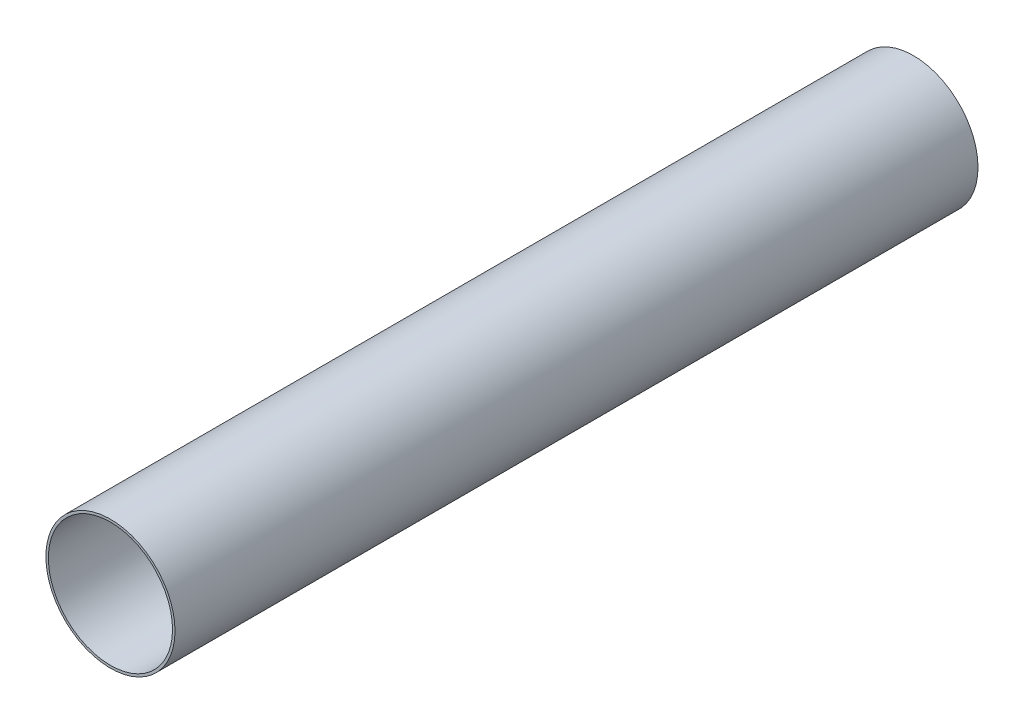
ISO-10303-21;
HEADER;
FILE_DESCRIPTION(('STEP AP214'),'2;1');
FILE_NAME('part.step','',(''),(''),'','','');
FILE_SCHEMA(('AUTOMOTIVE_DESIGN { 1 0 10303 214 1 1 1 1 }'));
ENDSEC;
DATA;
#1=APPLICATION_CONTEXT('core data for automotive mechanical design processes');
#2=APPLICATION_PROTOCOL_DEFINITION('international standard','automotive_design',2000,#1);
#3=PRODUCT_CONTEXT('',#1,'mechanical');
#4=PRODUCT('Part','Part','',(#3));
#5=PRODUCT_RELATED_PRODUCT_CATEGORY('part','',(#4));
#6=PRODUCT_DEFINITION_FORMATION('','',#4);
#7=PRODUCT_DEFINITION_CONTEXT('part definition',#1,'design');
#8=PRODUCT_DEFINITION('design','',#6,#7);
#9=PRODUCT_DEFINITION_SHAPE('','',#8);
#10=(LENGTH_UNIT() NAMED_UNIT(*) SI_UNIT(.MILLI.,.METRE.));
#11=(NAMED_UNIT(*) PLANE_ANGLE_UNIT() SI_UNIT($,.RADIAN.));
#12=(NAMED_UNIT(*) SI_UNIT($,.STERADIAN.) SOLID_ANGLE_UNIT());
#13=UNCERTAINTY_MEASURE_WITH_UNIT(LENGTH_MEASURE(1.E-05),#10,'distance_accuracy_value','');
#14=(GEOMETRIC_REPRESENTATION_CONTEXT(3) GLOBAL_UNCERTAINTY_ASSIGNED_CONTEXT((#13)) GLOBAL_UNIT_ASSIGNED_CONTEXT((#10,
#11,#12)) REPRESENTATION_CONTEXT('',''));
#15=CARTESIAN_POINT('',(0.,0.,0.));
#16=DIRECTION('',(0.,0.,1.));
#17=DIRECTION('',(1.,0.,0.));
#18=AXIS2_PLACEMENT_3D('',#15,#16,#17);
#19=CARTESIAN_POINT('',(2.71657696337968E-12,0.,-970.));
#20=DIRECTION('',(0.,0.,1.));
#21=DIRECTION('',(1.,0.,0.));
#22=AXIS2_PLACEMENT_3D('',#19,#20,#21);
#23=CYLINDRICAL_SURFACE('',#22,77.9999999999991);
#24=CARTESIAN_POINT('',(2.71657696337968E-12,0.,-970.));
#25=DIRECTION('',(0.,0.,1.));
#26=DIRECTION('',(1.,0.,0.));
#27=AXIS2_PLACEMENT_3D('',#24,#25,#26);
#28=CIRCLE('',#27,77.9999999999991);
#29=CARTESIAN_POINT('',(78.0000000000018,0.,-970.));
#30=VERTEX_POINT('',#29);
#31=EDGE_CURVE('E10',#30,#30,#28,.T.);
#32=ORIENTED_EDGE('',*,*,#31,.T.);
#33=EDGE_LOOP('',(#32));
#34=FACE_BOUND('',#33,.T.);
#35=CARTESIAN_POINT('',(2.71657696337968E-12,0.,0.));
#36=DIRECTION('',(0.,0.,1.));
#37=DIRECTION('',(1.,0.,0.));
#38=AXIS2_PLACEMENT_3D('',#35,#36,#37);
#39=CIRCLE('',#38,77.9999999999991);
#40=CARTESIAN_POINT('',(78.0000000000018,0.,0.));
#41=VERTEX_POINT('',#40);
#42=EDGE_CURVE('E34',#41,#41,#39,.T.);
#43=ORIENTED_EDGE('',*,*,#42,.F.);
#44=EDGE_LOOP('',(#43));
#45=FACE_BOUND('',#44,.T.);
#46=ADVANCED_FACE('F31',(#34,#45),#23,.T.);
#47=CARTESIAN_POINT('',(2.71657696337968E-12,0.,-970.));
#48=DIRECTION('',(0.,0.,1.));
#49=DIRECTION('',(1.,0.,0.));
#50=AXIS2_PLACEMENT_3D('',#47,#48,#49);
#51=PLANE('',#50);
#52=CARTESIAN_POINT('',(2.71657696337968E-12,0.,-970.));
#53=DIRECTION('',(0.,0.,1.));
#54=DIRECTION('',(1.,0.,0.));
#55=AXIS2_PLACEMENT_3D('',#52,#53,#54);
#56=CIRCLE('',#55,74.9999999999991);
#57=CARTESIAN_POINT('',(75.0000000000018,0.,-970.));
#58=VERTEX_POINT('',#57);
#59=EDGE_CURVE('E41',#58,#58,#56,.T.);
#60=ORIENTED_EDGE('',*,*,#59,.T.);
#61=EDGE_LOOP('',(#60));
#62=FACE_BOUND('',#61,.T.);
#63=ORIENTED_EDGE('',*,*,#31,.F.);
#64=EDGE_LOOP('',(#63));
#65=FACE_BOUND('',#64,.T.);
#66=ADVANCED_FACE('F49',(#62,#65),#51,.F.);
#67=CARTESIAN_POINT('',(2.71657696337968E-12,0.,0.));
#68=DIRECTION('',(0.,0.,1.));
#69=DIRECTION('',(1.,0.,0.));
#70=AXIS2_PLACEMENT_3D('',#67,#68,#69);
#71=PLANE('',#70);
#72=CARTESIAN_POINT('',(2.71657696337968E-12,0.,0.));
#73=DIRECTION('',(0.,0.,1.));
#74=DIRECTION('',(1.,0.,0.));
#75=AXIS2_PLACEMENT_3D('',#72,#73,#74);
#76=CIRCLE('',#75,74.9999999999991);
#77=CARTESIAN_POINT('',(75.0000000000018,0.,0.));
#78=VERTEX_POINT('',#77);
#79=EDGE_CURVE('E43',#78,#78,#76,.T.);
#80=ORIENTED_EDGE('',*,*,#79,.F.);
#81=EDGE_LOOP('',(#80));
#82=FACE_BOUND('',#81,.T.);
#83=ORIENTED_EDGE('',*,*,#42,.T.);
#84=EDGE_LOOP('',(#83));
#85=FACE_BOUND('',#84,.T.);
#86=ADVANCED_FACE('F55',(#82,#85),#71,.T.);
#87=CARTESIAN_POINT('',(2.71657696337968E-12,0.,-970.));
#88=DIRECTION('',(0.,0.,1.));
#89=DIRECTION('',(1.,0.,0.));
#90=AXIS2_PLACEMENT_3D('',#87,#88,#89);
#91=CYLINDRICAL_SURFACE('',#90,74.9999999999991);
#92=ORIENTED_EDGE('',*,*,#59,.F.);
#93=EDGE_LOOP('',(#92));
#94=FACE_BOUND('',#93,.T.);
#95=ORIENTED_EDGE('',*,*,#79,.T.);
#96=EDGE_LOOP('',(#95));
#97=FACE_BOUND('',#96,.T.);
#98=ADVANCED_FACE('F52',(#94,#97),#91,.F.);
#99=CLOSED_SHELL('',(#46,#66,#86,#98));
#100=MANIFOLD_SOLID_BREP('B2',#99);
#101=ADVANCED_BREP_SHAPE_REPRESENTATION('',(#18,#100),#14);
#102=SHAPE_DEFINITION_REPRESENTATION(#9,#101);
ENDSEC;
END-ISO-10303-21;
